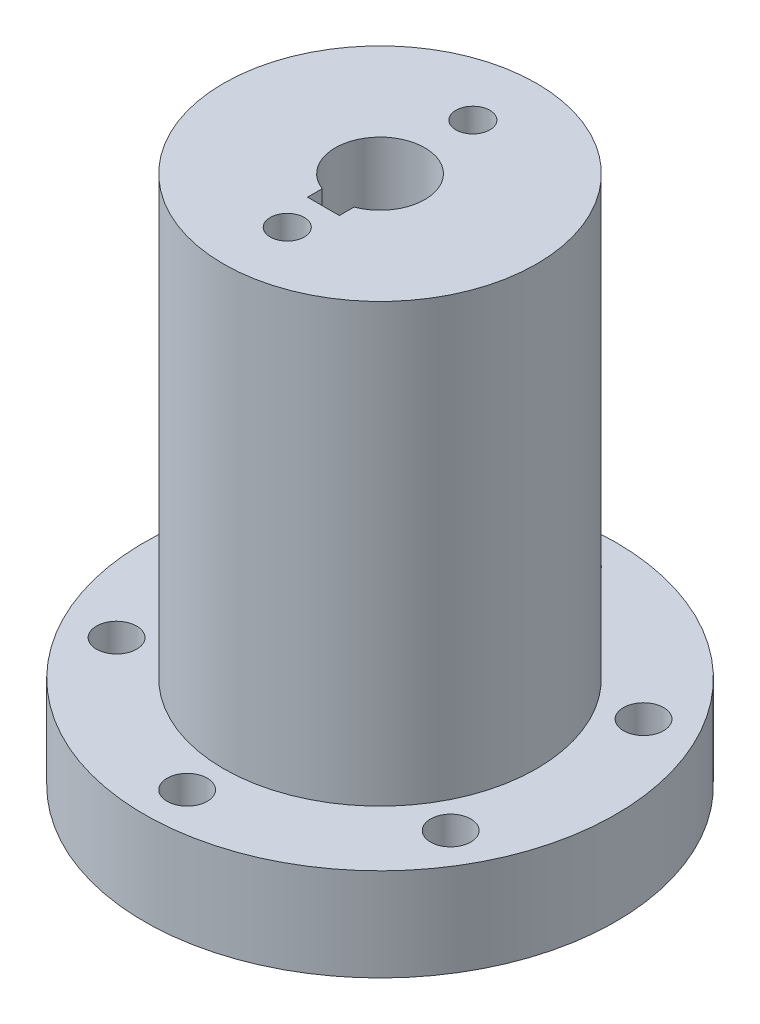
ISO-10303-21;
HEADER;
FILE_DESCRIPTION(('STEP AP214'),'2;1');
FILE_NAME('part.step','',(''),(''),'','','');
FILE_SCHEMA(('AUTOMOTIVE_DESIGN { 1 0 10303 214 1 1 1 1 }'));
ENDSEC;
DATA;
#1=APPLICATION_CONTEXT('core data for automotive mechanical design processes');
#2=APPLICATION_PROTOCOL_DEFINITION('international standard','automotive_design',2000,#1);
#3=PRODUCT_CONTEXT('',#1,'mechanical');
#4=PRODUCT('Part','Part','',(#3));
#5=PRODUCT_RELATED_PRODUCT_CATEGORY('part','',(#4));
#6=PRODUCT_DEFINITION_FORMATION('','',#4);
#7=PRODUCT_DEFINITION_CONTEXT('part definition',#1,'design');
#8=PRODUCT_DEFINITION('design','',#6,#7);
#9=PRODUCT_DEFINITION_SHAPE('','',#8);
#10=(LENGTH_UNIT() NAMED_UNIT(*) SI_UNIT(.MILLI.,.METRE.));
#11=(NAMED_UNIT(*) PLANE_ANGLE_UNIT() SI_UNIT($,.RADIAN.));
#12=(NAMED_UNIT(*) SI_UNIT($,.STERADIAN.) SOLID_ANGLE_UNIT());
#13=UNCERTAINTY_MEASURE_WITH_UNIT(LENGTH_MEASURE(1.E-05),#10,'distance_accuracy_value','');
#14=(GEOMETRIC_REPRESENTATION_CONTEXT(3) GLOBAL_UNCERTAINTY_ASSIGNED_CONTEXT((#13)) GLOBAL_UNIT_ASSIGNED_CONTEXT((#10,
#11,#12)) REPRESENTATION_CONTEXT('',''));
#15=CARTESIAN_POINT('',(0.,0.,0.));
#16=DIRECTION('',(0.,0.,1.));
#17=DIRECTION('',(1.,0.,0.));
#18=AXIS2_PLACEMENT_3D('',#15,#16,#17);
#19=CARTESIAN_POINT('',(0.,8.5,0.));
#20=DIRECTION('',(0.,-1.,0.));
#21=DIRECTION('',(0.,0.,-1.));
#22=AXIS2_PLACEMENT_3D('',#19,#20,#21);
#23=CYLINDRICAL_SURFACE('',#22,25.3);
#24=CARTESIAN_POINT('',(0.,0.,0.));
#25=DIRECTION('',(0.,1.,0.));
#26=DIRECTION('',(0.,0.,1.));
#27=AXIS2_PLACEMENT_3D('',#24,#25,#26);
#28=CIRCLE('',#27,25.3);
#29=CARTESIAN_POINT('',(0.,0.,25.3));
#30=VERTEX_POINT('',#29);
#31=EDGE_CURVE('E52',#30,#30,#28,.T.);
#32=ORIENTED_EDGE('',*,*,#31,.T.);
#33=EDGE_LOOP('',(#32));
#34=FACE_BOUND('',#33,.T.);
#35=CARTESIAN_POINT('',(0.,70.65,0.));
#36=DIRECTION('',(0.,1.,0.));
#37=DIRECTION('',(0.,0.,1.));
#38=AXIS2_PLACEMENT_3D('',#35,#36,#37);
#39=CIRCLE('',#38,25.3);
#40=CARTESIAN_POINT('',(0.,70.65,25.3));
#41=VERTEX_POINT('',#40);
#42=EDGE_CURVE('E236',#41,#41,#39,.T.);
#43=ORIENTED_EDGE('',*,*,#42,.F.);
#44=EDGE_LOOP('',(#43));
#45=FACE_BOUND('',#44,.T.);
#46=ADVANCED_FACE('F44',(#34,#45),#23,.T.);
#47=CARTESIAN_POINT('',(0.,-48.35,15.));
#48=DIRECTION('',(0.,1.,0.));
#49=DIRECTION('',(0.,0.,1.));
#50=AXIS2_PLACEMENT_3D('',#47,#48,#49);
#51=CYLINDRICAL_SURFACE('',#50,2.75);
#52=CARTESIAN_POINT('',(0.,-15.,15.));
#53=DIRECTION('',(0.,-1.,0.));
#54=DIRECTION('',(0.,0.,-1.));
#55=AXIS2_PLACEMENT_3D('',#52,#53,#54);
#56=CIRCLE('',#55,2.75);
#57=CARTESIAN_POINT('',(0.,-15.,12.25));
#58=VERTEX_POINT('',#57);
#59=EDGE_CURVE('E176',#58,#58,#56,.T.);
#60=ORIENTED_EDGE('',*,*,#59,.T.);
#61=EDGE_LOOP('',(#60));
#62=FACE_BOUND('',#61,.T.);
#63=CARTESIAN_POINT('',(0.,70.65,15.));
#64=DIRECTION('',(0.,1.,0.));
#65=DIRECTION('',(0.,0.,1.));
#66=AXIS2_PLACEMENT_3D('',#63,#64,#65);
#67=CIRCLE('',#66,2.75);
#68=CARTESIAN_POINT('',(0.,70.65,17.75));
#69=VERTEX_POINT('',#68);
#70=EDGE_CURVE('E247',#69,#69,#67,.F.);
#71=ORIENTED_EDGE('',*,*,#70,.F.);
#72=EDGE_LOOP('',(#71));
#73=FACE_BOUND('',#72,.T.);
#74=ADVANCED_FACE('F220',(#62,#73),#51,.F.);
#75=CARTESIAN_POINT('',(0.,-48.35,-15.));
#76=DIRECTION('',(0.,1.,0.));
#77=DIRECTION('',(0.,0.,1.));
#78=AXIS2_PLACEMENT_3D('',#75,#76,#77);
#79=CYLINDRICAL_SURFACE('',#78,2.75);
#80=CARTESIAN_POINT('',(0.,-15.,-15.));
#81=DIRECTION('',(0.,-1.,0.));
#82=DIRECTION('',(0.,0.,-1.));
#83=AXIS2_PLACEMENT_3D('',#80,#81,#82);
#84=CIRCLE('',#83,2.75);
#85=CARTESIAN_POINT('',(0.,-15.,-17.75));
#86=VERTEX_POINT('',#85);
#87=EDGE_CURVE('E137',#86,#86,#84,.T.);
#88=ORIENTED_EDGE('',*,*,#87,.T.);
#89=EDGE_LOOP('',(#88));
#90=FACE_BOUND('',#89,.T.);
#91=CARTESIAN_POINT('',(0.,70.65,-15.));
#92=DIRECTION('',(0.,1.,0.));
#93=DIRECTION('',(0.,0.,1.));
#94=AXIS2_PLACEMENT_3D('',#91,#92,#93);
#95=CIRCLE('',#94,2.75);
#96=CARTESIAN_POINT('',(0.,70.65,-12.25));
#97=VERTEX_POINT('',#96);
#98=EDGE_CURVE('E99',#97,#97,#95,.F.);
#99=ORIENTED_EDGE('',*,*,#98,.F.);
#100=EDGE_LOOP('',(#99));
#101=FACE_BOUND('',#100,.T.);
#102=ADVANCED_FACE('F183',(#90,#101),#79,.F.);
#103=CARTESIAN_POINT('',(0.,0.,0.));
#104=DIRECTION('',(0.,-1.,0.));
#105=DIRECTION('',(0.,0.,-1.));
#106=AXIS2_PLACEMENT_3D('',#103,#104,#105);
#107=PLANE('',#106);
#108=CARTESIAN_POINT('',(-27.,0.,15.5884572681199));
#109=DIRECTION('',(0.,1.,0.));
#110=DIRECTION('',(0.,0.,1.));
#111=AXIS2_PLACEMENT_3D('',#108,#109,#110);
#112=CIRCLE('',#111,3.25);
#113=CARTESIAN_POINT('',(-27.,0.,18.8384572681199));
#114=VERTEX_POINT('',#113);
#115=EDGE_CURVE('E133',#114,#114,#112,.T.);
#116=ORIENTED_EDGE('',*,*,#115,.F.);
#117=EDGE_LOOP('',(#116));
#118=FACE_BOUND('',#117,.T.);
#119=CARTESIAN_POINT('',(0.,0.,31.1769145362398));
#120=DIRECTION('',(0.,1.,0.));
#121=DIRECTION('',(0.,0.,1.));
#122=AXIS2_PLACEMENT_3D('',#119,#120,#121);
#123=CIRCLE('',#122,3.25);
#124=CARTESIAN_POINT('',(0.,0.,34.4269145362398));
#125=VERTEX_POINT('',#124);
#126=EDGE_CURVE('E129',#125,#125,#123,.T.);
#127=ORIENTED_EDGE('',*,*,#126,.F.);
#128=EDGE_LOOP('',(#127));
#129=FACE_BOUND('',#128,.T.);
#130=CARTESIAN_POINT('',(27.,0.,15.5884572681199));
#131=DIRECTION('',(0.,1.,0.));
#132=DIRECTION('',(0.,0.,1.));
#133=AXIS2_PLACEMENT_3D('',#130,#131,#132);
#134=CIRCLE('',#133,3.25);
#135=CARTESIAN_POINT('',(27.,0.,18.8384572681199));
#136=VERTEX_POINT('',#135);
#137=EDGE_CURVE('E125',#136,#136,#134,.T.);
#138=ORIENTED_EDGE('',*,*,#137,.F.);
#139=EDGE_LOOP('',(#138));
#140=FACE_BOUND('',#139,.T.);
#141=CARTESIAN_POINT('',(27.,0.,-15.5884572681199));
#142=DIRECTION('',(0.,1.,0.));
#143=DIRECTION('',(0.,0.,1.));
#144=AXIS2_PLACEMENT_3D('',#141,#142,#143);
#145=CIRCLE('',#144,3.25);
#146=CARTESIAN_POINT('',(27.,0.,-12.3384572681199));
#147=VERTEX_POINT('',#146);
#148=EDGE_CURVE('E121',#147,#147,#145,.T.);
#149=ORIENTED_EDGE('',*,*,#148,.F.);
#150=EDGE_LOOP('',(#149));
#151=FACE_BOUND('',#150,.T.);
#152=CARTESIAN_POINT('',(0.,0.,-31.1769145362398));
#153=DIRECTION('',(0.,1.,0.));
#154=DIRECTION('',(0.,0.,1.));
#155=AXIS2_PLACEMENT_3D('',#152,#153,#154);
#156=CIRCLE('',#155,3.25);
#157=CARTESIAN_POINT('',(0.,0.,-27.9269145362398));
#158=VERTEX_POINT('',#157);
#159=EDGE_CURVE('E116',#158,#158,#156,.T.);
#160=ORIENTED_EDGE('',*,*,#159,.F.);
#161=EDGE_LOOP('',(#160));
#162=FACE_BOUND('',#161,.T.);
#163=CARTESIAN_POINT('',(-27.,0.,-15.5884572681199));
#164=DIRECTION('',(0.,1.,0.));
#165=DIRECTION('',(0.,0.,1.));
#166=AXIS2_PLACEMENT_3D('',#163,#164,#165);
#167=CIRCLE('',#166,3.25);
#168=CARTESIAN_POINT('',(-27.,0.,-12.3384572681199));
#169=VERTEX_POINT('',#168);
#170=EDGE_CURVE('E120',#169,#169,#167,.T.);
#171=ORIENTED_EDGE('',*,*,#170,.F.);
#172=EDGE_LOOP('',(#171));
#173=FACE_BOUND('',#172,.T.);
#174=ORIENTED_EDGE('',*,*,#31,.F.);
#175=EDGE_LOOP('',(#174));
#176=FACE_BOUND('',#175,.T.);
#177=CARTESIAN_POINT('',(0.,0.,0.));
#178=DIRECTION('',(0.,-1.,0.));
#179=DIRECTION('',(0.,0.,-1.));
#180=AXIS2_PLACEMENT_3D('',#177,#178,#179);
#181=CIRCLE('',#180,38.1);
#182=CARTESIAN_POINT('',(0.,0.,-38.1));
#183=VERTEX_POINT('',#182);
#184=EDGE_CURVE('E146',#183,#183,#181,.T.);
#185=ORIENTED_EDGE('',*,*,#184,.F.);
#186=EDGE_LOOP('',(#185));
#187=FACE_BOUND('',#186,.T.);
#188=ADVANCED_FACE('F190',(#118,#129,#140,#151,#162,#173,#176,#187),#107,.F.);
#189=CARTESIAN_POINT('',(0.,-15.,0.));
#190=DIRECTION('',(0.,-1.,0.));
#191=DIRECTION('',(0.,0.,-1.));
#192=AXIS2_PLACEMENT_3D('',#189,#190,#191);
#193=PLANE('',#192);
#194=ORIENTED_EDGE('',*,*,#87,.F.);
#195=EDGE_LOOP('',(#194));
#196=FACE_BOUND('',#195,.T.);
#197=ORIENTED_EDGE('',*,*,#59,.F.);
#198=EDGE_LOOP('',(#197));
#199=FACE_BOUND('',#198,.T.);
#200=CARTESIAN_POINT('',(-27.,-15.,15.5884572681199));
#201=DIRECTION('',(0.,-1.,0.));
#202=DIRECTION('',(0.,0.,-1.));
#203=AXIS2_PLACEMENT_3D('',#200,#201,#202);
#204=CIRCLE('',#203,3.25);
#205=CARTESIAN_POINT('',(-27.,-15.,12.3384572681199));
#206=VERTEX_POINT('',#205);
#207=EDGE_CURVE('E150',#206,#206,#204,.T.);
#208=ORIENTED_EDGE('',*,*,#207,.F.);
#209=EDGE_LOOP('',(#208));
#210=FACE_BOUND('',#209,.T.);
#211=CARTESIAN_POINT('',(0.,-15.,31.1769145362398));
#212=DIRECTION('',(0.,-1.,0.));
#213=DIRECTION('',(0.,0.,-1.));
#214=AXIS2_PLACEMENT_3D('',#211,#212,#213);
#215=CIRCLE('',#214,3.25);
#216=CARTESIAN_POINT('',(0.,-15.,27.9269145362398));
#217=VERTEX_POINT('',#216);
#218=EDGE_CURVE('E169',#217,#217,#215,.T.);
#219=ORIENTED_EDGE('',*,*,#218,.F.);
#220=EDGE_LOOP('',(#219));
#221=FACE_BOUND('',#220,.T.);
#222=CARTESIAN_POINT('',(27.,-15.,15.5884572681199));
#223=DIRECTION('',(0.,-1.,0.));
#224=DIRECTION('',(0.,0.,-1.));
#225=AXIS2_PLACEMENT_3D('',#222,#223,#224);
#226=CIRCLE('',#225,3.25);
#227=CARTESIAN_POINT('',(27.,-15.,12.3384572681199));
#228=VERTEX_POINT('',#227);
#229=EDGE_CURVE('E165',#228,#228,#226,.T.);
#230=ORIENTED_EDGE('',*,*,#229,.F.);
#231=EDGE_LOOP('',(#230));
#232=FACE_BOUND('',#231,.T.);
#233=CARTESIAN_POINT('',(27.,-15.,-15.5884572681199));
#234=DIRECTION('',(0.,-1.,0.));
#235=DIRECTION('',(0.,0.,-1.));
#236=AXIS2_PLACEMENT_3D('',#233,#234,#235);
#237=CIRCLE('',#236,3.25);
#238=CARTESIAN_POINT('',(27.,-15.,-18.8384572681199));
#239=VERTEX_POINT('',#238);
#240=EDGE_CURVE('E161',#239,#239,#237,.T.);
#241=ORIENTED_EDGE('',*,*,#240,.F.);
#242=EDGE_LOOP('',(#241));
#243=FACE_BOUND('',#242,.T.);
#244=CARTESIAN_POINT('',(0.,-15.,-31.1769145362398));
#245=DIRECTION('',(0.,-1.,0.));
#246=DIRECTION('',(0.,0.,-1.));
#247=AXIS2_PLACEMENT_3D('',#244,#245,#246);
#248=CIRCLE('',#247,3.25);
#249=CARTESIAN_POINT('',(0.,-15.,-34.4269145362398));
#250=VERTEX_POINT('',#249);
#251=EDGE_CURVE('E157',#250,#250,#248,.T.);
#252=ORIENTED_EDGE('',*,*,#251,.F.);
#253=EDGE_LOOP('',(#252));
#254=FACE_BOUND('',#253,.T.);
#255=CARTESIAN_POINT('',(-27.,-15.,-15.5884572681199));
#256=DIRECTION('',(0.,-1.,0.));
#257=DIRECTION('',(0.,0.,-1.));
#258=AXIS2_PLACEMENT_3D('',#255,#256,#257);
#259=CIRCLE('',#258,3.25);
#260=CARTESIAN_POINT('',(-27.,-15.,-18.8384572681199));
#261=VERTEX_POINT('',#260);
#262=EDGE_CURVE('E141',#261,#261,#259,.T.);
#263=ORIENTED_EDGE('',*,*,#262,.F.);
#264=EDGE_LOOP('',(#263));
#265=FACE_BOUND('',#264,.T.);
#266=CARTESIAN_POINT('',(0.,-15.,0.));
#267=DIRECTION('',(0.,-1.,0.));
#268=DIRECTION('',(0.,0.,-1.));
#269=AXIS2_PLACEMENT_3D('',#266,#267,#268);
#270=CIRCLE('',#269,38.1);
#271=CARTESIAN_POINT('',(0.,-15.,-38.1));
#272=VERTEX_POINT('',#271);
#273=EDGE_CURVE('E142',#272,#272,#270,.T.);
#274=ORIENTED_EDGE('',*,*,#273,.T.);
#275=EDGE_LOOP('',(#274));
#276=FACE_BOUND('',#275,.T.);
#277=ADVANCED_FACE('F186',(#196,#199,#210,#221,#232,#243,#254,#265,#276),#193,.T.);
#278=CARTESIAN_POINT('',(0.,-15.,0.));
#279=DIRECTION('',(0.,1.,0.));
#280=DIRECTION('',(0.,0.,1.));
#281=AXIS2_PLACEMENT_3D('',#278,#279,#280);
#282=CYLINDRICAL_SURFACE('',#281,38.1);
#283=ORIENTED_EDGE('',*,*,#273,.F.);
#284=EDGE_LOOP('',(#283));
#285=FACE_BOUND('',#284,.T.);
#286=ORIENTED_EDGE('',*,*,#184,.T.);
#287=EDGE_LOOP('',(#286));
#288=FACE_BOUND('',#287,.T.);
#289=ADVANCED_FACE('F189',(#285,#288),#282,.T.);
#290=CARTESIAN_POINT('',(-27.,-20.,-15.5884572681199));
#291=DIRECTION('',(0.,1.,0.));
#292=DIRECTION('',(0.,0.,1.));
#293=AXIS2_PLACEMENT_3D('',#290,#291,#292);
#294=CYLINDRICAL_SURFACE('',#293,3.25);
#295=ORIENTED_EDGE('',*,*,#262,.T.);
#296=EDGE_LOOP('',(#295));
#297=FACE_BOUND('',#296,.T.);
#298=ORIENTED_EDGE('',*,*,#170,.T.);
#299=EDGE_LOOP('',(#298));
#300=FACE_BOUND('',#299,.T.);
#301=ADVANCED_FACE('F210',(#297,#300),#294,.F.);
#302=CARTESIAN_POINT('',(0.,-20.,-31.1769145362398));
#303=DIRECTION('',(0.,1.,0.));
#304=DIRECTION('',(0.,0.,1.));
#305=AXIS2_PLACEMENT_3D('',#302,#303,#304);
#306=CYLINDRICAL_SURFACE('',#305,3.25);
#307=ORIENTED_EDGE('',*,*,#251,.T.);
#308=EDGE_LOOP('',(#307));
#309=FACE_BOUND('',#308,.T.);
#310=ORIENTED_EDGE('',*,*,#159,.T.);
#311=EDGE_LOOP('',(#310));
#312=FACE_BOUND('',#311,.T.);
#313=ADVANCED_FACE('F282',(#309,#312),#306,.F.);
#314=CARTESIAN_POINT('',(27.,-20.,-15.5884572681199));
#315=DIRECTION('',(0.,1.,0.));
#316=DIRECTION('',(0.,0.,1.));
#317=AXIS2_PLACEMENT_3D('',#314,#315,#316);
#318=CYLINDRICAL_SURFACE('',#317,3.25);
#319=ORIENTED_EDGE('',*,*,#240,.T.);
#320=EDGE_LOOP('',(#319));
#321=FACE_BOUND('',#320,.T.);
#322=ORIENTED_EDGE('',*,*,#148,.T.);
#323=EDGE_LOOP('',(#322));
#324=FACE_BOUND('',#323,.T.);
#325=ADVANCED_FACE('F285',(#321,#324),#318,.F.);
#326=CARTESIAN_POINT('',(27.,-20.,15.5884572681199));
#327=DIRECTION('',(0.,1.,0.));
#328=DIRECTION('',(0.,0.,1.));
#329=AXIS2_PLACEMENT_3D('',#326,#327,#328);
#330=CYLINDRICAL_SURFACE('',#329,3.25);
#331=ORIENTED_EDGE('',*,*,#229,.T.);
#332=EDGE_LOOP('',(#331));
#333=FACE_BOUND('',#332,.T.);
#334=ORIENTED_EDGE('',*,*,#137,.T.);
#335=EDGE_LOOP('',(#334));
#336=FACE_BOUND('',#335,.T.);
#337=ADVANCED_FACE('F289',(#333,#336),#330,.F.);
#338=CARTESIAN_POINT('',(0.,-20.,31.1769145362398));
#339=DIRECTION('',(0.,1.,0.));
#340=DIRECTION('',(0.,0.,1.));
#341=AXIS2_PLACEMENT_3D('',#338,#339,#340);
#342=CYLINDRICAL_SURFACE('',#341,3.25);
#343=ORIENTED_EDGE('',*,*,#218,.T.);
#344=EDGE_LOOP('',(#343));
#345=FACE_BOUND('',#344,.T.);
#346=ORIENTED_EDGE('',*,*,#126,.T.);
#347=EDGE_LOOP('',(#346));
#348=FACE_BOUND('',#347,.T.);
#349=ADVANCED_FACE('F293',(#345,#348),#342,.F.);
#350=CARTESIAN_POINT('',(-27.,-20.,15.5884572681199));
#351=DIRECTION('',(0.,1.,0.));
#352=DIRECTION('',(0.,0.,1.));
#353=AXIS2_PLACEMENT_3D('',#350,#351,#352);
#354=CYLINDRICAL_SURFACE('',#353,3.25);
#355=ORIENTED_EDGE('',*,*,#207,.T.);
#356=EDGE_LOOP('',(#355));
#357=FACE_BOUND('',#356,.T.);
#358=ORIENTED_EDGE('',*,*,#115,.T.);
#359=EDGE_LOOP('',(#358));
#360=FACE_BOUND('',#359,.T.);
#361=ADVANCED_FACE('F273',(#357,#360),#354,.F.);
#362=CARTESIAN_POINT('',(0.,70.65,0.));
#363=DIRECTION('',(0.,1.,0.));
#364=DIRECTION('',(0.,0.,1.));
#365=AXIS2_PLACEMENT_3D('',#362,#363,#364);
#366=PLANE('',#365);
#367=DIRECTION('',(0.,0.,-1.));
#368=VECTOR('',#367,1.);
#369=CARTESIAN_POINT('',(2.575,70.65,0.));
#370=LINE('',#369,#368);
#371=CARTESIAN_POINT('',(2.575,70.65,9.15));
#372=VERTEX_POINT('',#371);
#373=CARTESIAN_POINT('',(2.575,70.65,6.77730588065789));
#374=VERTEX_POINT('',#373);
#375=EDGE_CURVE('E100',#372,#374,#370,.T.);
#376=ORIENTED_EDGE('',*,*,#375,.F.);
#377=DIRECTION('',(1.,0.,0.));
#378=VECTOR('',#377,1.);
#379=CARTESIAN_POINT('',(0.,70.65,9.15));
#380=LINE('',#379,#378);
#381=CARTESIAN_POINT('',(-2.575,70.65,9.15));
#382=VERTEX_POINT('',#381);
#383=EDGE_CURVE('E59',#382,#372,#380,.T.);
#384=ORIENTED_EDGE('',*,*,#383,.F.);
#385=DIRECTION('',(0.,0.,1.));
#386=VECTOR('',#385,1.);
#387=CARTESIAN_POINT('',(-2.575,70.65,0.));
#388=LINE('',#387,#386);
#389=CARTESIAN_POINT('',(-2.575,70.65,6.77730588065789));
#390=VERTEX_POINT('',#389);
#391=EDGE_CURVE('E11',#390,#382,#388,.T.);
#392=ORIENTED_EDGE('',*,*,#391,.F.);
#393=CARTESIAN_POINT('',(0.,70.65,0.));
#394=DIRECTION('',(0.,1.,0.));
#395=DIRECTION('',(0.,0.,1.));
#396=AXIS2_PLACEMENT_3D('',#393,#394,#395);
#397=CIRCLE('',#396,7.25);
#398=EDGE_CURVE('E85',#374,#390,#397,.T.);
#399=ORIENTED_EDGE('',*,*,#398,.F.);
#400=EDGE_LOOP('',(#376,#384,#392,#399));
#401=FACE_BOUND('',#400,.T.);
#402=ORIENTED_EDGE('',*,*,#42,.T.);
#403=EDGE_LOOP('',(#402));
#404=FACE_BOUND('',#403,.T.);
#405=ORIENTED_EDGE('',*,*,#98,.T.);
#406=EDGE_LOOP('',(#405));
#407=FACE_BOUND('',#406,.T.);
#408=ORIENTED_EDGE('',*,*,#70,.T.);
#409=EDGE_LOOP('',(#408));
#410=FACE_BOUND('',#409,.T.);
#411=ADVANCED_FACE('F83',(#401,#404,#407,#410),#366,.T.);
#412=CARTESIAN_POINT('',(0.,40.65,0.));
#413=DIRECTION('',(0.,1.,0.));
#414=DIRECTION('',(0.,0.,1.));
#415=AXIS2_PLACEMENT_3D('',#412,#413,#414);
#416=PLANE('',#415);
#417=CARTESIAN_POINT('',(0.,40.65,0.));
#418=DIRECTION('',(0.,1.,0.));
#419=DIRECTION('',(0.,0.,1.));
#420=AXIS2_PLACEMENT_3D('',#417,#418,#419);
#421=CIRCLE('',#420,7.25);
#422=CARTESIAN_POINT('',(-2.575,40.65,6.77730588065789));
#423=VERTEX_POINT('',#422);
#424=CARTESIAN_POINT('',(2.575,40.65,6.77730588065789));
#425=VERTEX_POINT('',#424);
#426=EDGE_CURVE('E251',#423,#425,#421,.F.);
#427=ORIENTED_EDGE('',*,*,#426,.F.);
#428=DIRECTION('',(0.,0.,-1.));
#429=VECTOR('',#428,1.);
#430=CARTESIAN_POINT('',(-2.575,40.65,0.));
#431=LINE('',#430,#429);
#432=CARTESIAN_POINT('',(-2.575,40.65,9.15));
#433=VERTEX_POINT('',#432);
#434=EDGE_CURVE('E104',#433,#423,#431,.T.);
#435=ORIENTED_EDGE('',*,*,#434,.F.);
#436=DIRECTION('',(-1.,0.,0.));
#437=VECTOR('',#436,1.);
#438=CARTESIAN_POINT('',(0.,40.65,9.15));
#439=LINE('',#438,#437);
#440=CARTESIAN_POINT('',(2.575,40.65,9.15));
#441=VERTEX_POINT('',#440);
#442=EDGE_CURVE('E112',#441,#433,#439,.T.);
#443=ORIENTED_EDGE('',*,*,#442,.F.);
#444=DIRECTION('',(0.,0.,1.));
#445=VECTOR('',#444,1.);
#446=CARTESIAN_POINT('',(2.575,40.65,0.));
#447=LINE('',#446,#445);
#448=EDGE_CURVE('E66',#425,#441,#447,.T.);
#449=ORIENTED_EDGE('',*,*,#448,.F.);
#450=EDGE_LOOP('',(#427,#435,#443,#449));
#451=FACE_BOUND('',#450,.T.);
#452=ADVANCED_FACE('F266',(#451),#416,.T.);
#453=CARTESIAN_POINT('',(-2.575,40.65,0.));
#454=DIRECTION('',(1.,0.,0.));
#455=DIRECTION('',(0.,0.,-1.));
#456=AXIS2_PLACEMENT_3D('',#453,#454,#455);
#457=PLANE('',#456);
#458=DIRECTION('',(0.,1.,0.));
#459=VECTOR('',#458,1.);
#460=CARTESIAN_POINT('',(-2.575,40.65,6.77730588065789));
#461=LINE('',#460,#459);
#462=EDGE_CURVE('E95',#423,#390,#461,.T.);
#463=ORIENTED_EDGE('',*,*,#462,.T.);
#464=ORIENTED_EDGE('',*,*,#391,.T.);
#465=DIRECTION('',(0.,1.,0.));
#466=VECTOR('',#465,1.);
#467=CARTESIAN_POINT('',(-2.575,40.65,9.15));
#468=LINE('',#467,#466);
#469=EDGE_CURVE('E106',#433,#382,#468,.T.);
#470=ORIENTED_EDGE('',*,*,#469,.F.);
#471=ORIENTED_EDGE('',*,*,#434,.T.);
#472=EDGE_LOOP('',(#463,#464,#470,#471));
#473=FACE_BOUND('',#472,.T.);
#474=ADVANCED_FACE('F102',(#473),#457,.T.);
#475=CARTESIAN_POINT('',(0.,40.65,9.15));
#476=DIRECTION('',(0.,0.,-1.));
#477=DIRECTION('',(-1.,0.,0.));
#478=AXIS2_PLACEMENT_3D('',#475,#476,#477);
#479=PLANE('',#478);
#480=ORIENTED_EDGE('',*,*,#469,.T.);
#481=ORIENTED_EDGE('',*,*,#383,.T.);
#482=DIRECTION('',(0.,1.,0.));
#483=VECTOR('',#482,1.);
#484=CARTESIAN_POINT('',(2.575,40.65,9.15));
#485=LINE('',#484,#483);
#486=EDGE_CURVE('E110',#441,#372,#485,.T.);
#487=ORIENTED_EDGE('',*,*,#486,.F.);
#488=ORIENTED_EDGE('',*,*,#442,.T.);
#489=EDGE_LOOP('',(#480,#481,#487,#488));
#490=FACE_BOUND('',#489,.T.);
#491=ADVANCED_FACE('F265',(#490),#479,.T.);
#492=CARTESIAN_POINT('',(2.575,40.65,0.));
#493=DIRECTION('',(-1.,0.,0.));
#494=DIRECTION('',(0.,0.,1.));
#495=AXIS2_PLACEMENT_3D('',#492,#493,#494);
#496=PLANE('',#495);
#497=ORIENTED_EDGE('',*,*,#486,.T.);
#498=ORIENTED_EDGE('',*,*,#375,.T.);
#499=DIRECTION('',(0.,1.,0.));
#500=VECTOR('',#499,1.);
#501=CARTESIAN_POINT('',(2.575,40.65,6.77730588065789));
#502=LINE('',#501,#500);
#503=EDGE_CURVE('E97',#425,#374,#502,.T.);
#504=ORIENTED_EDGE('',*,*,#503,.F.);
#505=ORIENTED_EDGE('',*,*,#448,.T.);
#506=EDGE_LOOP('',(#497,#498,#504,#505));
#507=FACE_BOUND('',#506,.T.);
#508=ADVANCED_FACE('F263',(#507),#496,.T.);
#509=CARTESIAN_POINT('',(0.,40.65,0.));
#510=DIRECTION('',(0.,1.,0.));
#511=DIRECTION('',(0.,0.,1.));
#512=AXIS2_PLACEMENT_3D('',#509,#510,#511);
#513=CYLINDRICAL_SURFACE('',#512,7.25);
#514=ORIENTED_EDGE('',*,*,#503,.T.);
#515=ORIENTED_EDGE('',*,*,#398,.T.);
#516=ORIENTED_EDGE('',*,*,#462,.F.);
#517=ORIENTED_EDGE('',*,*,#426,.T.);
#518=EDGE_LOOP('',(#514,#515,#516,#517));
#519=FACE_BOUND('',#518,.T.);
#520=ADVANCED_FACE('F94',(#519),#513,.F.);
#521=CLOSED_SHELL('',(#46,#74,#102,#188,#277,#289,#301,#313,#325,#337,#349,#361,#411,#452,#474,
#491,#508,#520));
#522=MANIFOLD_SOLID_BREP('B2',#521);
#523=ADVANCED_BREP_SHAPE_REPRESENTATION('',(#18,#522),#14);
#524=SHAPE_DEFINITION_REPRESENTATION(#9,#523);
ENDSEC;
END-ISO-10303-21;
